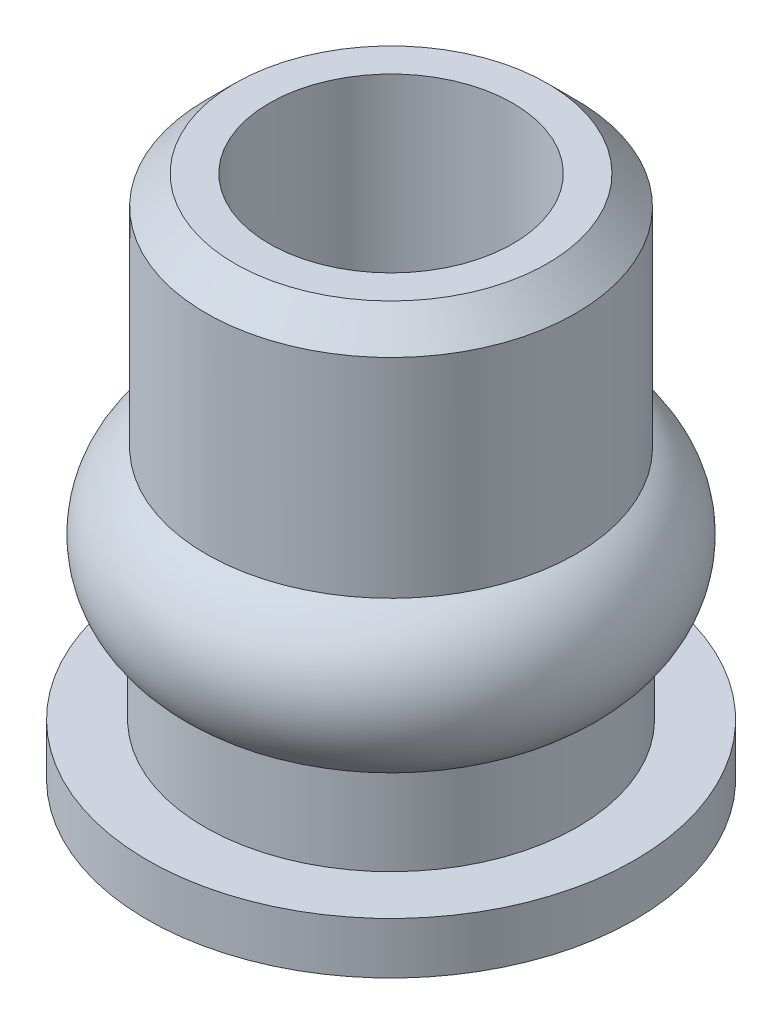
ISO-10303-21;
HEADER;
FILE_DESCRIPTION(('STEP AP214'),'2;1');
FILE_NAME('part.step','',(''),(''),'','','');
FILE_SCHEMA(('AUTOMOTIVE_DESIGN { 1 0 10303 214 1 1 1 1 }'));
ENDSEC;
DATA;
#1=APPLICATION_CONTEXT('core data for automotive mechanical design processes');
#2=APPLICATION_PROTOCOL_DEFINITION('international standard','automotive_design',2000,#1);
#3=PRODUCT_CONTEXT('',#1,'mechanical');
#4=PRODUCT('Part','Part','',(#3));
#5=PRODUCT_RELATED_PRODUCT_CATEGORY('part','',(#4));
#6=PRODUCT_DEFINITION_FORMATION('','',#4);
#7=PRODUCT_DEFINITION_CONTEXT('part definition',#1,'design');
#8=PRODUCT_DEFINITION('design','',#6,#7);
#9=PRODUCT_DEFINITION_SHAPE('','',#8);
#10=(LENGTH_UNIT() NAMED_UNIT(*) SI_UNIT(.MILLI.,.METRE.));
#11=(NAMED_UNIT(*) PLANE_ANGLE_UNIT() SI_UNIT($,.RADIAN.));
#12=(NAMED_UNIT(*) SI_UNIT($,.STERADIAN.) SOLID_ANGLE_UNIT());
#13=UNCERTAINTY_MEASURE_WITH_UNIT(LENGTH_MEASURE(1.E-05),#10,'distance_accuracy_value','');
#14=(GEOMETRIC_REPRESENTATION_CONTEXT(3) GLOBAL_UNCERTAINTY_ASSIGNED_CONTEXT((#13)) GLOBAL_UNIT_ASSIGNED_CONTEXT((#10,
#11,#12)) REPRESENTATION_CONTEXT('',''));
#15=CARTESIAN_POINT('',(0.,0.,0.));
#16=DIRECTION('',(0.,0.,1.));
#17=DIRECTION('',(1.,0.,0.));
#18=AXIS2_PLACEMENT_3D('',#15,#16,#17);
#19=CARTESIAN_POINT('',(0.,0.,0.));
#20=DIRECTION('',(0.,-1.,0.));
#21=DIRECTION('',(1.,0.,0.));
#22=AXIS2_PLACEMENT_3D('',#19,#20,#21);
#23=PLANE('',#22);
#24=CARTESIAN_POINT('',(0.,0.,0.));
#25=DIRECTION('',(0.,-1.,0.));
#26=DIRECTION('',(0.,0.,-1.));
#27=AXIS2_PLACEMENT_3D('',#24,#25,#26);
#28=CIRCLE('',#27,4.25);
#29=CARTESIAN_POINT('',(0.,0.,-4.25));
#30=VERTEX_POINT('',#29);
#31=EDGE_CURVE('E67',#30,#30,#28,.T.);
#32=ORIENTED_EDGE('',*,*,#31,.F.);
#33=EDGE_LOOP('',(#32));
#34=FACE_BOUND('',#33,.T.);
#35=CARTESIAN_POINT('',(0.,0.,0.));
#36=DIRECTION('',(0.,-1.,0.));
#37=DIRECTION('',(1.,0.,0.));
#38=AXIS2_PLACEMENT_3D('',#35,#36,#37);
#39=CIRCLE('',#38,8.5);
#40=CARTESIAN_POINT('',(8.5,0.,0.));
#41=VERTEX_POINT('',#40);
#42=EDGE_CURVE('E46',#41,#41,#39,.T.);
#43=ORIENTED_EDGE('',*,*,#42,.T.);
#44=EDGE_LOOP('',(#43));
#45=FACE_BOUND('',#44,.T.);
#46=ADVANCED_FACE('F35',(#34,#45),#23,.T.);
#47=CARTESIAN_POINT('',(0.,0.,0.));
#48=DIRECTION('',(0.,-1.,0.));
#49=DIRECTION('',(1.,0.,0.));
#50=AXIS2_PLACEMENT_3D('',#47,#48,#49);
#51=CYLINDRICAL_SURFACE('',#50,8.5);
#52=CARTESIAN_POINT('',(0.,1.8,0.));
#53=DIRECTION('',(0.,-1.,0.));
#54=DIRECTION('',(1.,0.,0.));
#55=AXIS2_PLACEMENT_3D('',#52,#53,#54);
#56=CIRCLE('',#55,8.5);
#57=CARTESIAN_POINT('',(8.5,1.8,0.));
#58=VERTEX_POINT('',#57);
#59=EDGE_CURVE('E50',#58,#58,#56,.T.);
#60=ORIENTED_EDGE('',*,*,#59,.T.);
#61=EDGE_LOOP('',(#60));
#62=FACE_BOUND('',#61,.T.);
#63=ORIENTED_EDGE('',*,*,#42,.F.);
#64=EDGE_LOOP('',(#63));
#65=FACE_BOUND('',#64,.T.);
#66=ADVANCED_FACE('F75',(#62,#65),#51,.T.);
#67=CARTESIAN_POINT('',(8.5,1.8,0.));
#68=DIRECTION('',(0.,1.,0.));
#69=DIRECTION('',(-1.,0.,0.));
#70=AXIS2_PLACEMENT_3D('',#67,#68,#69);
#71=PLANE('',#70);
#72=CARTESIAN_POINT('',(0.,1.8,0.));
#73=DIRECTION('',(0.,-1.,0.));
#74=DIRECTION('',(1.,0.,0.));
#75=AXIS2_PLACEMENT_3D('',#72,#73,#74);
#76=CIRCLE('',#75,6.5);
#77=CARTESIAN_POINT('',(6.5,1.8,0.));
#78=VERTEX_POINT('',#77);
#79=EDGE_CURVE('E55',#78,#78,#76,.T.);
#80=ORIENTED_EDGE('',*,*,#79,.T.);
#81=EDGE_LOOP('',(#80));
#82=FACE_BOUND('',#81,.T.);
#83=ORIENTED_EDGE('',*,*,#59,.F.);
#84=EDGE_LOOP('',(#83));
#85=FACE_BOUND('',#84,.T.);
#86=ADVANCED_FACE('F79',(#82,#85),#71,.T.);
#87=CARTESIAN_POINT('',(0.,0.,0.));
#88=DIRECTION('',(0.,-1.,0.));
#89=DIRECTION('',(1.,0.,0.));
#90=AXIS2_PLACEMENT_3D('',#87,#88,#89);
#91=CYLINDRICAL_SURFACE('',#90,6.5);
#92=CARTESIAN_POINT('',(0.,4.8,0.));
#93=DIRECTION('',(0.,-1.,0.));
#94=DIRECTION('',(1.,0.,0.));
#95=AXIS2_PLACEMENT_3D('',#92,#93,#94);
#96=CIRCLE('',#95,6.5);
#97=CARTESIAN_POINT('',(6.5,4.8,0.));
#98=VERTEX_POINT('',#97);
#99=EDGE_CURVE('E58',#98,#98,#96,.T.);
#100=ORIENTED_EDGE('',*,*,#99,.T.);
#101=EDGE_LOOP('',(#100));
#102=FACE_BOUND('',#101,.T.);
#103=ORIENTED_EDGE('',*,*,#79,.F.);
#104=EDGE_LOOP('',(#103));
#105=FACE_BOUND('',#104,.T.);
#106=ADVANCED_FACE('F85',(#102,#105),#91,.T.);
#107=CARTESIAN_POINT('',(0.,7.39807621135331,0.));
#108=DIRECTION('',(0.,-1.,0.));
#109=DIRECTION('',(1.,0.,0.));
#110=AXIS2_PLACEMENT_3D('',#107,#108,#109);
#111=TOROIDAL_SURFACE('',#110,5.,3.);
#112=CARTESIAN_POINT('',(0.,10.0243854086871,0.));
#113=DIRECTION('',(0.,-1.,0.));
#114=DIRECTION('',(1.,0.,0.));
#115=AXIS2_PLACEMENT_3D('',#112,#113,#114);
#116=CIRCLE('',#115,6.45);
#117=CARTESIAN_POINT('',(6.45,10.0243854086871,0.));
#118=VERTEX_POINT('',#117);
#119=EDGE_CURVE('E61',#118,#118,#116,.T.);
#120=ORIENTED_EDGE('',*,*,#119,.T.);
#121=EDGE_LOOP('',(#120));
#122=FACE_BOUND('',#121,.T.);
#123=ORIENTED_EDGE('',*,*,#99,.F.);
#124=EDGE_LOOP('',(#123));
#125=FACE_BOUND('',#124,.T.);
#126=ADVANCED_FACE('F91',(#122,#125),#111,.T.);
#127=CARTESIAN_POINT('',(0.,0.,0.));
#128=DIRECTION('',(0.,-1.,0.));
#129=DIRECTION('',(1.,0.,0.));
#130=AXIS2_PLACEMENT_3D('',#127,#128,#129);
#131=CYLINDRICAL_SURFACE('',#130,6.45);
#132=CARTESIAN_POINT('',(0.,17.3,0.));
#133=DIRECTION('',(0.,1.,0.));
#134=DIRECTION('',(-1.,0.,0.));
#135=AXIS2_PLACEMENT_3D('',#132,#133,#134);
#136=CIRCLE('',#135,6.45);
#137=CARTESIAN_POINT('',(-6.45,17.3,0.));
#138=VERTEX_POINT('',#137);
#139=EDGE_CURVE('E42',#138,#138,#136,.F.);
#140=ORIENTED_EDGE('',*,*,#139,.T.);
#141=EDGE_LOOP('',(#140));
#142=FACE_BOUND('',#141,.T.);
#143=ORIENTED_EDGE('',*,*,#119,.F.);
#144=EDGE_LOOP('',(#143));
#145=FACE_BOUND('',#144,.T.);
#146=ADVANCED_FACE('F95',(#142,#145),#131,.T.);
#147=CARTESIAN_POINT('',(6.45,18.3,0.));
#148=DIRECTION('',(0.,1.,0.));
#149=DIRECTION('',(-1.,0.,0.));
#150=AXIS2_PLACEMENT_3D('',#147,#148,#149);
#151=PLANE('',#150);
#152=CARTESIAN_POINT('',(0.,18.3,0.));
#153=DIRECTION('',(0.,1.,0.));
#154=DIRECTION('',(-1.,0.,0.));
#155=AXIS2_PLACEMENT_3D('',#152,#153,#154);
#156=CIRCLE('',#155,5.45);
#157=CARTESIAN_POINT('',(-5.45,18.3,0.));
#158=VERTEX_POINT('',#157);
#159=EDGE_CURVE('E10',#158,#158,#156,.T.);
#160=ORIENTED_EDGE('',*,*,#159,.T.);
#161=EDGE_LOOP('',(#160));
#162=FACE_BOUND('',#161,.T.);
#163=CARTESIAN_POINT('',(0.,18.3,0.));
#164=DIRECTION('',(0.,1.,0.));
#165=DIRECTION('',(-1.,0.,0.));
#166=AXIS2_PLACEMENT_3D('',#163,#164,#165);
#167=CIRCLE('',#166,4.24999999999999);
#168=CARTESIAN_POINT('',(-4.24999999999999,18.3,0.));
#169=VERTEX_POINT('',#168);
#170=EDGE_CURVE('E64',#169,#169,#167,.T.);
#171=ORIENTED_EDGE('',*,*,#170,.F.);
#172=EDGE_LOOP('',(#171));
#173=FACE_BOUND('',#172,.T.);
#174=ADVANCED_FACE('F99',(#162,#173),#151,.T.);
#175=CARTESIAN_POINT('',(0.,0.,0.));
#176=DIRECTION('',(0.,-1.,0.));
#177=DIRECTION('',(0.,0.,-1.));
#178=AXIS2_PLACEMENT_3D('',#175,#176,#177);
#179=CYLINDRICAL_SURFACE('',#178,4.24999999999999);
#180=ORIENTED_EDGE('',*,*,#170,.T.);
#181=EDGE_LOOP('',(#180));
#182=FACE_BOUND('',#181,.T.);
#183=ORIENTED_EDGE('',*,*,#31,.T.);
#184=EDGE_LOOP('',(#183));
#185=FACE_BOUND('',#184,.T.);
#186=ADVANCED_FACE('F71',(#182,#185),#179,.F.);
#187=CARTESIAN_POINT('',(0.,17.3,0.));
#188=DIRECTION('',(0.,-1.,0.));
#189=DIRECTION('',(1.,0.,0.));
#190=AXIS2_PLACEMENT_3D('',#187,#188,#189);
#191=CONICAL_SURFACE('',#190,6.45,0.785398163397449);
#192=ORIENTED_EDGE('',*,*,#159,.F.);
#193=EDGE_LOOP('',(#192));
#194=FACE_BOUND('',#193,.T.);
#195=ORIENTED_EDGE('',*,*,#139,.F.);
#196=EDGE_LOOP('',(#195));
#197=FACE_BOUND('',#196,.T.);
#198=ADVANCED_FACE('F37',(#194,#197),#191,.T.);
#199=CLOSED_SHELL('',(#46,#66,#86,#106,#126,#146,#174,#186,#198));
#200=MANIFOLD_SOLID_BREP('B2',#199);
#201=ADVANCED_BREP_SHAPE_REPRESENTATION('',(#18,#200),#14);
#202=SHAPE_DEFINITION_REPRESENTATION(#9,#201);
ENDSEC;
END-ISO-10303-21;
